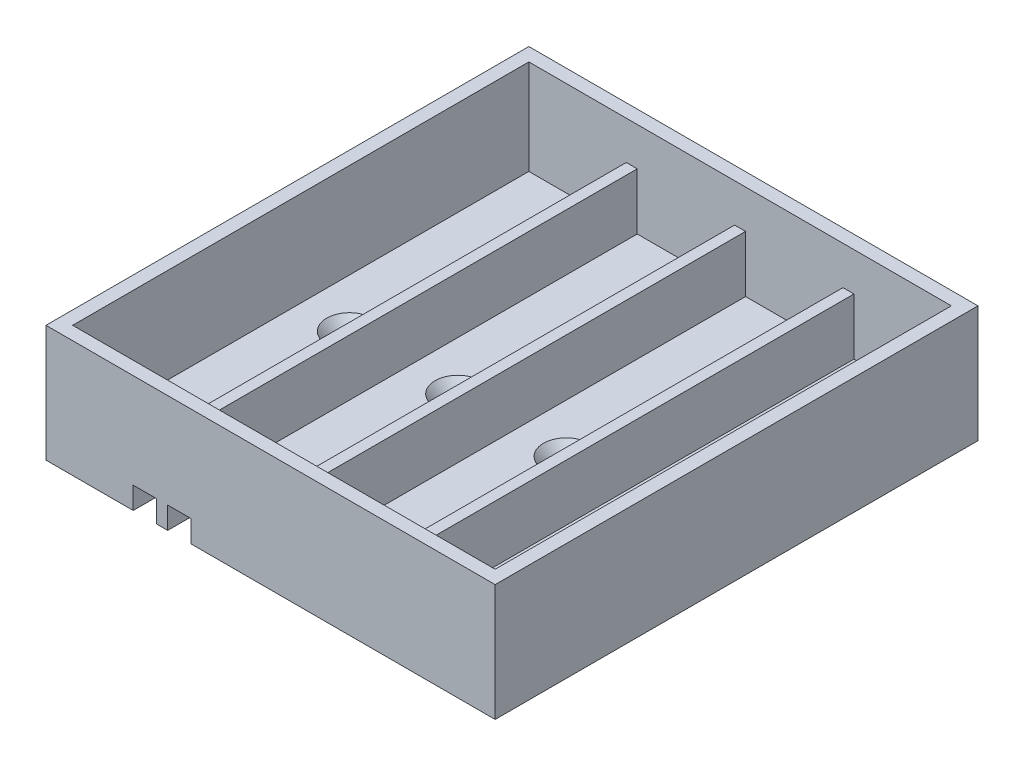
ISO-10303-21;
HEADER;
FILE_DESCRIPTION(('STEP AP214'),'2;1');
FILE_NAME('part.step','',(''),(''),'','','');
FILE_SCHEMA(('AUTOMOTIVE_DESIGN { 1 0 10303 214 1 1 1 1 }'));
ENDSEC;
DATA;
#1=APPLICATION_CONTEXT('core data for automotive mechanical design processes');
#2=APPLICATION_PROTOCOL_DEFINITION('international standard','automotive_design',2000,#1);
#3=PRODUCT_CONTEXT('',#1,'mechanical');
#4=PRODUCT('Part','Part','',(#3));
#5=PRODUCT_RELATED_PRODUCT_CATEGORY('part','',(#4));
#6=PRODUCT_DEFINITION_FORMATION('','',#4);
#7=PRODUCT_DEFINITION_CONTEXT('part definition',#1,'design');
#8=PRODUCT_DEFINITION('design','',#6,#7);
#9=PRODUCT_DEFINITION_SHAPE('','',#8);
#10=(LENGTH_UNIT() NAMED_UNIT(*) SI_UNIT(.MILLI.,.METRE.));
#11=(NAMED_UNIT(*) PLANE_ANGLE_UNIT() SI_UNIT($,.RADIAN.));
#12=(NAMED_UNIT(*) SI_UNIT($,.STERADIAN.) SOLID_ANGLE_UNIT());
#13=UNCERTAINTY_MEASURE_WITH_UNIT(LENGTH_MEASURE(1.E-05),#10,'distance_accuracy_value','');
#14=(GEOMETRIC_REPRESENTATION_CONTEXT(3) GLOBAL_UNCERTAINTY_ASSIGNED_CONTEXT((#13)) GLOBAL_UNIT_ASSIGNED_CONTEXT((#10,
#11,#12)) REPRESENTATION_CONTEXT('',''));
#15=CARTESIAN_POINT('',(0.,0.,0.));
#16=DIRECTION('',(0.,0.,1.));
#17=DIRECTION('',(1.,0.,0.));
#18=AXIS2_PLACEMENT_3D('',#15,#16,#17);
#19=CARTESIAN_POINT('',(-28.65,14.9,29.1));
#20=DIRECTION('',(0.,0.,-1.));
#21=DIRECTION('',(-1.,0.,0.));
#22=AXIS2_PLACEMENT_3D('',#19,#20,#21);
#23=PLANE('',#22);
#24=DIRECTION('',(-1.,0.,0.));
#25=VECTOR('',#24,1.);
#26=CARTESIAN_POINT('',(-28.65,10.,29.1));
#27=LINE('',#26,#25);
#28=CARTESIAN_POINT('',(14.525,10.,29.1));
#29=VERTEX_POINT('',#28);
#30=CARTESIAN_POINT('',(13.125,10.,29.1));
#31=VERTEX_POINT('',#30);
#32=EDGE_CURVE('E82',#29,#31,#27,.T.);
#33=ORIENTED_EDGE('',*,*,#32,.T.);
#34=DIRECTION('',(0.,-1.,0.));
#35=VECTOR('',#34,1.);
#36=CARTESIAN_POINT('',(13.125,14.9,29.1));
#37=LINE('',#36,#35);
#38=CARTESIAN_POINT('',(13.125,2.8,29.1));
#39=VERTEX_POINT('',#38);
#40=EDGE_CURVE('E291',#31,#39,#37,.T.);
#41=ORIENTED_EDGE('',*,*,#40,.T.);
#42=DIRECTION('',(-1.,0.,0.));
#43=VECTOR('',#42,1.);
#44=CARTESIAN_POINT('',(0.,2.8,29.1));
#45=LINE('',#44,#43);
#46=CARTESIAN_POINT('',(0.699999999999989,2.8,29.1));
#47=VERTEX_POINT('',#46);
#48=EDGE_CURVE('E450',#39,#47,#45,.T.);
#49=ORIENTED_EDGE('',*,*,#48,.T.);
#50=DIRECTION('',(0.,-1.,0.));
#51=VECTOR('',#50,1.);
#52=CARTESIAN_POINT('',(0.699999999999989,14.9,29.1));
#53=LINE('',#52,#51);
#54=CARTESIAN_POINT('',(0.699999999999989,10.,29.1));
#55=VERTEX_POINT('',#54);
#56=EDGE_CURVE('E307',#55,#47,#53,.T.);
#57=ORIENTED_EDGE('',*,*,#56,.F.);
#58=DIRECTION('',(-1.,0.,0.));
#59=VECTOR('',#58,1.);
#60=CARTESIAN_POINT('',(-28.65,10.,29.1));
#61=LINE('',#60,#59);
#62=CARTESIAN_POINT('',(-0.700000000000006,10.,29.1));
#63=VERTEX_POINT('',#62);
#64=EDGE_CURVE('E320',#55,#63,#61,.T.);
#65=ORIENTED_EDGE('',*,*,#64,.T.);
#66=DIRECTION('',(0.,-1.,0.));
#67=VECTOR('',#66,1.);
#68=CARTESIAN_POINT('',(-0.700000000000006,14.9,29.1));
#69=LINE('',#68,#67);
#70=CARTESIAN_POINT('',(-0.700000000000006,2.8,29.1));
#71=VERTEX_POINT('',#70);
#72=EDGE_CURVE('E315',#63,#71,#69,.T.);
#73=ORIENTED_EDGE('',*,*,#72,.T.);
#74=CARTESIAN_POINT('',(-10.125,2.8,29.1));
#75=VERTEX_POINT('',#74);
#76=EDGE_CURVE('E572',#71,#75,#45,.T.);
#77=ORIENTED_EDGE('',*,*,#76,.T.);
#78=CARTESIAN_POINT('',(-13.125,2.8,29.1));
#79=VERTEX_POINT('',#78);
#80=EDGE_CURVE('E379',#75,#79,#45,.T.);
#81=ORIENTED_EDGE('',*,*,#80,.T.);
#82=DIRECTION('',(0.,-1.,0.));
#83=VECTOR('',#82,1.);
#84=CARTESIAN_POINT('',(-13.125,14.9,29.1));
#85=LINE('',#84,#83);
#86=CARTESIAN_POINT('',(-13.125,10.,29.1));
#87=VERTEX_POINT('',#86);
#88=EDGE_CURVE('E341',#87,#79,#85,.T.);
#89=ORIENTED_EDGE('',*,*,#88,.F.);
#90=DIRECTION('',(-1.,0.,0.));
#91=VECTOR('',#90,1.);
#92=CARTESIAN_POINT('',(-28.65,10.,29.1));
#93=LINE('',#92,#91);
#94=CARTESIAN_POINT('',(-14.525,10.,29.1));
#95=VERTEX_POINT('',#94);
#96=EDGE_CURVE('E344',#87,#95,#93,.T.);
#97=ORIENTED_EDGE('',*,*,#96,.T.);
#98=DIRECTION('',(0.,-1.,0.));
#99=VECTOR('',#98,1.);
#100=CARTESIAN_POINT('',(-14.525,14.9,29.1));
#101=LINE('',#100,#99);
#102=CARTESIAN_POINT('',(-14.525,2.8,29.1));
#103=VERTEX_POINT('',#102);
#104=EDGE_CURVE('E333',#95,#103,#101,.T.);
#105=ORIENTED_EDGE('',*,*,#104,.T.);
#106=CARTESIAN_POINT('',(-17.525,2.8,29.1));
#107=VERTEX_POINT('',#106);
#108=EDGE_CURVE('E411',#103,#107,#45,.T.);
#109=ORIENTED_EDGE('',*,*,#108,.T.);
#110=CARTESIAN_POINT('',(-26.95,2.8,29.1));
#111=VERTEX_POINT('',#110);
#112=EDGE_CURVE('E446',#107,#111,#45,.T.);
#113=ORIENTED_EDGE('',*,*,#112,.T.);
#114=DIRECTION('',(0.,-1.,0.));
#115=VECTOR('',#114,1.);
#116=CARTESIAN_POINT('',(-26.95,14.9,29.1));
#117=LINE('',#116,#115);
#118=CARTESIAN_POINT('',(-26.95,14.9,29.1));
#119=VERTEX_POINT('',#118);
#120=EDGE_CURVE('E419',#119,#111,#117,.T.);
#121=ORIENTED_EDGE('',*,*,#120,.F.);
#122=DIRECTION('',(1.,0.,0.));
#123=VECTOR('',#122,1.);
#124=CARTESIAN_POINT('',(-28.65,14.9,29.1));
#125=LINE('',#124,#123);
#126=CARTESIAN_POINT('',(26.95,14.9,29.1));
#127=VERTEX_POINT('',#126);
#128=EDGE_CURVE('E408',#119,#127,#125,.T.);
#129=ORIENTED_EDGE('',*,*,#128,.T.);
#130=DIRECTION('',(0.,-1.,0.));
#131=VECTOR('',#130,1.);
#132=CARTESIAN_POINT('',(26.95,14.9,29.1));
#133=LINE('',#132,#131);
#134=CARTESIAN_POINT('',(26.95,2.8,29.1));
#135=VERTEX_POINT('',#134);
#136=EDGE_CURVE('E427',#127,#135,#133,.T.);
#137=ORIENTED_EDGE('',*,*,#136,.T.);
#138=CARTESIAN_POINT('',(14.525,2.8,29.1));
#139=VERTEX_POINT('',#138);
#140=EDGE_CURVE('E447',#135,#139,#45,.T.);
#141=ORIENTED_EDGE('',*,*,#140,.T.);
#142=DIRECTION('',(0.,-1.,0.));
#143=VECTOR('',#142,1.);
#144=CARTESIAN_POINT('',(14.525,14.9,29.1));
#145=LINE('',#144,#143);
#146=EDGE_CURVE('E87',#29,#139,#145,.T.);
#147=ORIENTED_EDGE('',*,*,#146,.F.);
#148=EDGE_LOOP('',(#33,#41,#49,#57,#65,#73,#77,#81,#89,#97,#105,#109,#113,#121,#129,#137,#141,#147));
#149=FACE_BOUND('',#148,.T.);
#150=ADVANCED_FACE('F66',(#149),#23,.T.);
#151=CARTESIAN_POINT('',(-28.65,14.9,-29.1));
#152=DIRECTION('',(0.,0.,-1.));
#153=DIRECTION('',(-1.,0.,0.));
#154=AXIS2_PLACEMENT_3D('',#151,#152,#153);
#155=PLANE('',#154);
#156=DIRECTION('',(0.,-1.,0.));
#157=VECTOR('',#156,1.);
#158=CARTESIAN_POINT('',(13.125,14.9,-29.1));
#159=LINE('',#158,#157);
#160=CARTESIAN_POINT('',(13.125,10.,-29.1));
#161=VERTEX_POINT('',#160);
#162=CARTESIAN_POINT('',(13.125,2.8,-29.1));
#163=VERTEX_POINT('',#162);
#164=EDGE_CURVE('E288',#161,#163,#159,.T.);
#165=ORIENTED_EDGE('',*,*,#164,.F.);
#166=DIRECTION('',(-1.,0.,0.));
#167=VECTOR('',#166,1.);
#168=CARTESIAN_POINT('',(-28.65,10.,-29.1));
#169=LINE('',#168,#167);
#170=CARTESIAN_POINT('',(14.525,10.,-29.1));
#171=VERTEX_POINT('',#170);
#172=EDGE_CURVE('E273',#171,#161,#169,.T.);
#173=ORIENTED_EDGE('',*,*,#172,.F.);
#174=DIRECTION('',(0.,-1.,0.));
#175=VECTOR('',#174,1.);
#176=CARTESIAN_POINT('',(14.525,14.9,-29.1));
#177=LINE('',#176,#175);
#178=CARTESIAN_POINT('',(14.525,2.8,-29.1));
#179=VERTEX_POINT('',#178);
#180=EDGE_CURVE('E270',#171,#179,#177,.T.);
#181=ORIENTED_EDGE('',*,*,#180,.T.);
#182=DIRECTION('',(-1.,0.,0.));
#183=VECTOR('',#182,1.);
#184=CARTESIAN_POINT('',(0.,2.8,-29.1));
#185=LINE('',#184,#183);
#186=CARTESIAN_POINT('',(26.95,2.8,-29.1));
#187=VERTEX_POINT('',#186);
#188=EDGE_CURVE('E256',#187,#179,#185,.T.);
#189=ORIENTED_EDGE('',*,*,#188,.F.);
#190=DIRECTION('',(0.,-1.,0.));
#191=VECTOR('',#190,1.);
#192=CARTESIAN_POINT('',(26.95,14.9,-29.1));
#193=LINE('',#192,#191);
#194=CARTESIAN_POINT('',(26.95,14.9,-29.1));
#195=VERTEX_POINT('',#194);
#196=EDGE_CURVE('E425',#195,#187,#193,.T.);
#197=ORIENTED_EDGE('',*,*,#196,.F.);
#198=DIRECTION('',(1.,0.,0.));
#199=VECTOR('',#198,1.);
#200=CARTESIAN_POINT('',(-28.65,14.9,-29.1));
#201=LINE('',#200,#199);
#202=CARTESIAN_POINT('',(-26.95,14.9,-29.1));
#203=VERTEX_POINT('',#202);
#204=EDGE_CURVE('E413',#203,#195,#201,.T.);
#205=ORIENTED_EDGE('',*,*,#204,.F.);
#206=DIRECTION('',(0.,-1.,0.));
#207=VECTOR('',#206,1.);
#208=CARTESIAN_POINT('',(-26.95,14.9,-29.1));
#209=LINE('',#208,#207);
#210=CARTESIAN_POINT('',(-26.95,2.8,-29.1));
#211=VERTEX_POINT('',#210);
#212=EDGE_CURVE('E422',#203,#211,#209,.T.);
#213=ORIENTED_EDGE('',*,*,#212,.T.);
#214=CARTESIAN_POINT('',(-14.525,2.8,-29.1));
#215=VERTEX_POINT('',#214);
#216=EDGE_CURVE('E268',#215,#211,#185,.T.);
#217=ORIENTED_EDGE('',*,*,#216,.F.);
#218=DIRECTION('',(0.,-1.,0.));
#219=VECTOR('',#218,1.);
#220=CARTESIAN_POINT('',(-14.525,14.9,-29.1));
#221=LINE('',#220,#219);
#222=CARTESIAN_POINT('',(-14.525,10.,-29.1));
#223=VERTEX_POINT('',#222);
#224=EDGE_CURVE('E330',#223,#215,#221,.T.);
#225=ORIENTED_EDGE('',*,*,#224,.F.);
#226=DIRECTION('',(-1.,0.,0.));
#227=VECTOR('',#226,1.);
#228=CARTESIAN_POINT('',(-28.65,10.,-29.1));
#229=LINE('',#228,#227);
#230=CARTESIAN_POINT('',(-13.125,10.,-29.1));
#231=VERTEX_POINT('',#230);
#232=EDGE_CURVE('E473',#231,#223,#229,.T.);
#233=ORIENTED_EDGE('',*,*,#232,.F.);
#234=DIRECTION('',(0.,-1.,0.));
#235=VECTOR('',#234,1.);
#236=CARTESIAN_POINT('',(-13.125,14.9,-29.1));
#237=LINE('',#236,#235);
#238=CARTESIAN_POINT('',(-13.125,2.8,-29.1));
#239=VERTEX_POINT('',#238);
#240=EDGE_CURVE('E338',#231,#239,#237,.T.);
#241=ORIENTED_EDGE('',*,*,#240,.T.);
#242=CARTESIAN_POINT('',(-0.700000000000006,2.8,-29.1));
#243=VERTEX_POINT('',#242);
#244=EDGE_CURVE('E583',#243,#239,#185,.T.);
#245=ORIENTED_EDGE('',*,*,#244,.F.);
#246=DIRECTION('',(0.,-1.,0.));
#247=VECTOR('',#246,1.);
#248=CARTESIAN_POINT('',(-0.700000000000006,14.9,-29.1));
#249=LINE('',#248,#247);
#250=CARTESIAN_POINT('',(-0.700000000000006,10.,-29.1));
#251=VERTEX_POINT('',#250);
#252=EDGE_CURVE('E312',#251,#243,#249,.T.);
#253=ORIENTED_EDGE('',*,*,#252,.F.);
#254=DIRECTION('',(-1.,0.,0.));
#255=VECTOR('',#254,1.);
#256=CARTESIAN_POINT('',(-28.65,10.,-29.1));
#257=LINE('',#256,#255);
#258=CARTESIAN_POINT('',(0.699999999999989,10.,-29.1));
#259=VERTEX_POINT('',#258);
#260=EDGE_CURVE('E317',#259,#251,#257,.T.);
#261=ORIENTED_EDGE('',*,*,#260,.F.);
#262=DIRECTION('',(0.,-1.,0.));
#263=VECTOR('',#262,1.);
#264=CARTESIAN_POINT('',(0.699999999999989,14.9,-29.1));
#265=LINE('',#264,#263);
#266=CARTESIAN_POINT('',(0.699999999999989,2.8,-29.1));
#267=VERTEX_POINT('',#266);
#268=EDGE_CURVE('E304',#259,#267,#265,.T.);
#269=ORIENTED_EDGE('',*,*,#268,.T.);
#270=EDGE_CURVE('E266',#163,#267,#185,.T.);
#271=ORIENTED_EDGE('',*,*,#270,.F.);
#272=EDGE_LOOP('',(#165,#173,#181,#189,#197,#205,#213,#217,#225,#233,#241,#245,#253,#261,#269,#271));
#273=FACE_BOUND('',#272,.T.);
#274=ADVANCED_FACE('F271',(#273),#155,.F.);
#275=CARTESIAN_POINT('',(0.,2.8,0.));
#276=DIRECTION('',(0.,1.,0.));
#277=DIRECTION('',(0.,0.,1.));
#278=AXIS2_PLACEMENT_3D('',#275,#276,#277);
#279=PLANE('',#278);
#280=CARTESIAN_POINT('',(6.91249999999999,2.8,0.));
#281=DIRECTION('',(0.,1.,0.));
#282=DIRECTION('',(0.,0.,1.));
#283=AXIS2_PLACEMENT_3D('',#280,#281,#282);
#284=CIRCLE('',#283,2.9);
#285=CARTESIAN_POINT('',(6.91249999999999,2.8,2.89999999999999));
#286=VERTEX_POINT('',#285);
#287=EDGE_CURVE('E488',#286,#286,#284,.F.);
#288=ORIENTED_EDGE('',*,*,#287,.T.);
#289=EDGE_LOOP('',(#288));
#290=FACE_BOUND('',#289,.T.);
#291=ORIENTED_EDGE('',*,*,#48,.F.);
#292=DIRECTION('',(0.,0.,-1.));
#293=VECTOR('',#292,1.);
#294=CARTESIAN_POINT('',(13.125,2.8,0.));
#295=LINE('',#294,#293);
#296=EDGE_CURVE('E286',#39,#163,#295,.T.);
#297=ORIENTED_EDGE('',*,*,#296,.T.);
#298=ORIENTED_EDGE('',*,*,#270,.T.);
#299=DIRECTION('',(0.,0.,-1.));
#300=VECTOR('',#299,1.);
#301=CARTESIAN_POINT('',(0.699999999999989,2.8,0.));
#302=LINE('',#301,#300);
#303=EDGE_CURVE('E301',#47,#267,#302,.T.);
#304=ORIENTED_EDGE('',*,*,#303,.F.);
#305=EDGE_LOOP('',(#291,#297,#298,#304));
#306=FACE_BOUND('',#305,.T.);
#307=ADVANCED_FACE('F511',(#290,#306),#279,.T.);
#308=CARTESIAN_POINT('',(-6.91250000000001,2.8,0.));
#309=DIRECTION('',(0.,1.,0.));
#310=DIRECTION('',(0.,0.,1.));
#311=AXIS2_PLACEMENT_3D('',#308,#309,#310);
#312=CIRCLE('',#311,2.89999999999999);
#313=CARTESIAN_POINT('',(-6.91250000000001,2.8,2.89999999999999));
#314=VERTEX_POINT('',#313);
#315=EDGE_CURVE('E482',#314,#314,#312,.F.);
#316=ORIENTED_EDGE('',*,*,#315,.T.);
#317=EDGE_LOOP('',(#316));
#318=FACE_BOUND('',#317,.T.);
#319=ORIENTED_EDGE('',*,*,#76,.F.);
#320=DIRECTION('',(0.,0.,-1.));
#321=VECTOR('',#320,1.);
#322=CARTESIAN_POINT('',(-0.700000000000006,2.8,0.));
#323=LINE('',#322,#321);
#324=EDGE_CURVE('E310',#71,#243,#323,.T.);
#325=ORIENTED_EDGE('',*,*,#324,.T.);
#326=ORIENTED_EDGE('',*,*,#244,.T.);
#327=DIRECTION('',(0.,0.,-1.));
#328=VECTOR('',#327,1.);
#329=CARTESIAN_POINT('',(-13.125,2.8,0.));
#330=LINE('',#329,#328);
#331=CARTESIAN_POINT('',(-13.125,2.8,24.));
#332=VERTEX_POINT('',#331);
#333=EDGE_CURVE('E335',#332,#239,#330,.T.);
#334=ORIENTED_EDGE('',*,*,#333,.F.);
#335=DIRECTION('',(1.,0.,0.));
#336=VECTOR('',#335,1.);
#337=CARTESIAN_POINT('',(-13.125,2.8,24.));
#338=LINE('',#337,#336);
#339=CARTESIAN_POINT('',(-10.125,2.8,24.));
#340=VERTEX_POINT('',#339);
#341=EDGE_CURVE('E385',#332,#340,#338,.T.);
#342=ORIENTED_EDGE('',*,*,#341,.T.);
#343=DIRECTION('',(0.,0.,-1.));
#344=VECTOR('',#343,1.);
#345=CARTESIAN_POINT('',(-10.125,2.8,30.8));
#346=LINE('',#345,#344);
#347=EDGE_CURVE('E397',#75,#340,#346,.T.);
#348=ORIENTED_EDGE('',*,*,#347,.F.);
#349=EDGE_LOOP('',(#319,#325,#326,#334,#342,#348));
#350=FACE_BOUND('',#349,.T.);
#351=ADVANCED_FACE('F567',(#318,#350),#279,.T.);
#352=CARTESIAN_POINT('',(-20.7375,2.8,0.));
#353=DIRECTION('',(0.,1.,0.));
#354=DIRECTION('',(0.,0.,1.));
#355=AXIS2_PLACEMENT_3D('',#352,#353,#354);
#356=CIRCLE('',#355,2.9);
#357=CARTESIAN_POINT('',(-20.7375,2.8,2.9));
#358=VERTEX_POINT('',#357);
#359=EDGE_CURVE('E476',#358,#358,#356,.F.);
#360=ORIENTED_EDGE('',*,*,#359,.T.);
#361=EDGE_LOOP('',(#360));
#362=FACE_BOUND('',#361,.T.);
#363=DIRECTION('',(1.,0.,0.));
#364=VECTOR('',#363,1.);
#365=CARTESIAN_POINT('',(-17.525,2.8,24.));
#366=LINE('',#365,#364);
#367=CARTESIAN_POINT('',(-17.525,2.8,24.));
#368=VERTEX_POINT('',#367);
#369=CARTESIAN_POINT('',(-14.525,2.8,24.));
#370=VERTEX_POINT('',#369);
#371=EDGE_CURVE('E369',#368,#370,#366,.T.);
#372=ORIENTED_EDGE('',*,*,#371,.T.);
#373=DIRECTION('',(0.,0.,-1.));
#374=VECTOR('',#373,1.);
#375=CARTESIAN_POINT('',(-14.525,2.8,0.));
#376=LINE('',#375,#374);
#377=EDGE_CURVE('E328',#370,#215,#376,.T.);
#378=ORIENTED_EDGE('',*,*,#377,.T.);
#379=ORIENTED_EDGE('',*,*,#216,.T.);
#380=DIRECTION('',(0.,0.,1.));
#381=VECTOR('',#380,1.);
#382=CARTESIAN_POINT('',(-26.95,2.8,0.));
#383=LINE('',#382,#381);
#384=EDGE_CURVE('E442',#211,#111,#383,.T.);
#385=ORIENTED_EDGE('',*,*,#384,.T.);
#386=ORIENTED_EDGE('',*,*,#112,.F.);
#387=DIRECTION('',(0.,0.,-1.));
#388=VECTOR('',#387,1.);
#389=CARTESIAN_POINT('',(-17.525,2.8,30.8));
#390=LINE('',#389,#388);
#391=EDGE_CURVE('E353',#107,#368,#390,.T.);
#392=ORIENTED_EDGE('',*,*,#391,.T.);
#393=EDGE_LOOP('',(#372,#378,#379,#385,#386,#392));
#394=FACE_BOUND('',#393,.T.);
#395=ADVANCED_FACE('F524',(#362,#394),#279,.T.);
#396=CARTESIAN_POINT('',(20.7375,2.8,0.));
#397=DIRECTION('',(0.,1.,0.));
#398=DIRECTION('',(0.,0.,1.));
#399=AXIS2_PLACEMENT_3D('',#396,#397,#398);
#400=CIRCLE('',#399,2.9);
#401=CARTESIAN_POINT('',(20.7375,2.8,2.9));
#402=VERTEX_POINT('',#401);
#403=EDGE_CURVE('E75',#402,#402,#400,.F.);
#404=ORIENTED_EDGE('',*,*,#403,.T.);
#405=EDGE_LOOP('',(#404));
#406=FACE_BOUND('',#405,.T.);
#407=DIRECTION('',(0.,0.,-1.));
#408=VECTOR('',#407,1.);
#409=CARTESIAN_POINT('',(14.525,2.8,0.));
#410=LINE('',#409,#408);
#411=EDGE_CURVE('E261',#139,#179,#410,.T.);
#412=ORIENTED_EDGE('',*,*,#411,.F.);
#413=ORIENTED_EDGE('',*,*,#140,.F.);
#414=DIRECTION('',(0.,0.,1.));
#415=VECTOR('',#414,1.);
#416=CARTESIAN_POINT('',(26.95,2.8,0.));
#417=LINE('',#416,#415);
#418=EDGE_CURVE('E262',#187,#135,#417,.T.);
#419=ORIENTED_EDGE('',*,*,#418,.F.);
#420=ORIENTED_EDGE('',*,*,#188,.T.);
#421=EDGE_LOOP('',(#412,#413,#419,#420));
#422=FACE_BOUND('',#421,.T.);
#423=ADVANCED_FACE('F258',(#406,#422),#279,.T.);
#424=CARTESIAN_POINT('',(-28.65,2.8,30.8));
#425=DIRECTION('',(0.,0.,-1.));
#426=DIRECTION('',(-1.,0.,0.));
#427=AXIS2_PLACEMENT_3D('',#424,#425,#426);
#428=PLANE('',#427);
#429=DIRECTION('',(1.,0.,0.));
#430=VECTOR('',#429,1.);
#431=CARTESIAN_POINT('',(-28.65,0.,30.8));
#432=LINE('',#431,#430);
#433=CARTESIAN_POINT('',(-10.125,0.,30.8));
#434=VERTEX_POINT('',#433);
#435=CARTESIAN_POINT('',(28.65,0.,30.8));
#436=VERTEX_POINT('',#435);
#437=EDGE_CURVE('E449',#434,#436,#432,.T.);
#438=ORIENTED_EDGE('',*,*,#437,.T.);
#439=DIRECTION('',(0.,-1.,0.));
#440=VECTOR('',#439,1.);
#441=CARTESIAN_POINT('',(28.65,2.8,30.8));
#442=LINE('',#441,#440);
#443=CARTESIAN_POINT('',(28.65,14.9,30.8));
#444=VERTEX_POINT('',#443);
#445=EDGE_CURVE('E470',#444,#436,#442,.T.);
#446=ORIENTED_EDGE('',*,*,#445,.F.);
#447=DIRECTION('',(1.,0.,0.));
#448=VECTOR('',#447,1.);
#449=CARTESIAN_POINT('',(-28.65,14.9,30.8));
#450=LINE('',#449,#448);
#451=CARTESIAN_POINT('',(-28.65,14.9,30.8));
#452=VERTEX_POINT('',#451);
#453=EDGE_CURVE('E430',#452,#444,#450,.T.);
#454=ORIENTED_EDGE('',*,*,#453,.F.);
#455=DIRECTION('',(0.,-1.,0.));
#456=VECTOR('',#455,1.);
#457=CARTESIAN_POINT('',(-28.65,2.8,30.8));
#458=LINE('',#457,#456);
#459=CARTESIAN_POINT('',(-28.65,0.,30.8));
#460=VERTEX_POINT('',#459);
#461=EDGE_CURVE('E463',#452,#460,#458,.T.);
#462=ORIENTED_EDGE('',*,*,#461,.T.);
#463=CARTESIAN_POINT('',(-17.525,0.,30.8));
#464=VERTEX_POINT('',#463);
#465=EDGE_CURVE('E451',#460,#464,#432,.T.);
#466=ORIENTED_EDGE('',*,*,#465,.T.);
#467=DIRECTION('',(0.,-1.,0.));
#468=VECTOR('',#467,1.);
#469=CARTESIAN_POINT('',(-17.525,10.2323616704248,30.8));
#470=LINE('',#469,#468);
#471=CARTESIAN_POINT('',(-17.525,2.8,30.8));
#472=VERTEX_POINT('',#471);
#473=EDGE_CURVE('E357',#472,#464,#470,.T.);
#474=ORIENTED_EDGE('',*,*,#473,.F.);
#475=DIRECTION('',(1.,0.,0.));
#476=VECTOR('',#475,1.);
#477=CARTESIAN_POINT('',(-17.525,2.8,30.8));
#478=LINE('',#477,#476);
#479=CARTESIAN_POINT('',(-14.525,2.8,30.8));
#480=VERTEX_POINT('',#479);
#481=EDGE_CURVE('E363',#472,#480,#478,.T.);
#482=ORIENTED_EDGE('',*,*,#481,.T.);
#483=DIRECTION('',(0.,-1.,0.));
#484=VECTOR('',#483,1.);
#485=CARTESIAN_POINT('',(-14.525,10.2323616704248,30.8));
#486=LINE('',#485,#484);
#487=CARTESIAN_POINT('',(-14.525,0.,30.8));
#488=VERTEX_POINT('',#487);
#489=EDGE_CURVE('E358',#480,#488,#486,.T.);
#490=ORIENTED_EDGE('',*,*,#489,.T.);
#491=CARTESIAN_POINT('',(-13.125,0.,30.8));
#492=VERTEX_POINT('',#491);
#493=EDGE_CURVE('E455',#488,#492,#432,.T.);
#494=ORIENTED_EDGE('',*,*,#493,.T.);
#495=DIRECTION('',(0.,-1.,0.));
#496=VECTOR('',#495,1.);
#497=CARTESIAN_POINT('',(-13.125,10.2323616704248,30.8));
#498=LINE('',#497,#496);
#499=CARTESIAN_POINT('',(-13.125,2.8,30.8));
#500=VERTEX_POINT('',#499);
#501=EDGE_CURVE('E346',#500,#492,#498,.T.);
#502=ORIENTED_EDGE('',*,*,#501,.F.);
#503=DIRECTION('',(1.,0.,0.));
#504=VECTOR('',#503,1.);
#505=CARTESIAN_POINT('',(-13.125,2.8,30.8));
#506=LINE('',#505,#504);
#507=CARTESIAN_POINT('',(-10.125,2.8,30.8));
#508=VERTEX_POINT('',#507);
#509=EDGE_CURVE('E366',#500,#508,#506,.T.);
#510=ORIENTED_EDGE('',*,*,#509,.T.);
#511=DIRECTION('',(0.,-1.,0.));
#512=VECTOR('',#511,1.);
#513=CARTESIAN_POINT('',(-10.125,10.2323616704248,30.8));
#514=LINE('',#513,#512);
#515=EDGE_CURVE('E389',#508,#434,#514,.T.);
#516=ORIENTED_EDGE('',*,*,#515,.T.);
#517=EDGE_LOOP('',(#438,#446,#454,#462,#466,#474,#482,#490,#494,#502,#510,#516));
#518=FACE_BOUND('',#517,.T.);
#519=ADVANCED_FACE('F523',(#518),#428,.F.);
#520=CARTESIAN_POINT('',(28.65,2.8,30.8));
#521=DIRECTION('',(-1.,0.,0.));
#522=DIRECTION('',(0.,0.,1.));
#523=AXIS2_PLACEMENT_3D('',#520,#521,#522);
#524=PLANE('',#523);
#525=DIRECTION('',(0.,0.,-1.));
#526=VECTOR('',#525,1.);
#527=CARTESIAN_POINT('',(28.65,0.,30.8));
#528=LINE('',#527,#526);
#529=CARTESIAN_POINT('',(28.65,0.,-30.8));
#530=VERTEX_POINT('',#529);
#531=EDGE_CURVE('E454',#436,#530,#528,.T.);
#532=ORIENTED_EDGE('',*,*,#531,.T.);
#533=DIRECTION('',(0.,-1.,0.));
#534=VECTOR('',#533,1.);
#535=CARTESIAN_POINT('',(28.65,2.8,-30.8));
#536=LINE('',#535,#534);
#537=CARTESIAN_POINT('',(28.65,14.9,-30.8));
#538=VERTEX_POINT('',#537);
#539=EDGE_CURVE('E467',#538,#530,#536,.T.);
#540=ORIENTED_EDGE('',*,*,#539,.F.);
#541=DIRECTION('',(0.,0.,-1.));
#542=VECTOR('',#541,1.);
#543=CARTESIAN_POINT('',(28.65,14.9,30.8));
#544=LINE('',#543,#542);
#545=EDGE_CURVE('E433',#444,#538,#544,.T.);
#546=ORIENTED_EDGE('',*,*,#545,.F.);
#547=ORIENTED_EDGE('',*,*,#445,.T.);
#548=EDGE_LOOP('',(#532,#540,#546,#547));
#549=FACE_BOUND('',#548,.T.);
#550=ADVANCED_FACE('F535',(#549),#524,.F.);
#551=CARTESIAN_POINT('',(-28.65,2.8,-30.8));
#552=DIRECTION('',(0.,0.,-1.));
#553=DIRECTION('',(-1.,0.,0.));
#554=AXIS2_PLACEMENT_3D('',#551,#552,#553);
#555=PLANE('',#554);
#556=ORIENTED_EDGE('',*,*,#539,.T.);
#557=DIRECTION('',(1.,0.,0.));
#558=VECTOR('',#557,1.);
#559=CARTESIAN_POINT('',(-28.65,0.,-30.8));
#560=LINE('',#559,#558);
#561=CARTESIAN_POINT('',(-28.65,0.,-30.8));
#562=VERTEX_POINT('',#561);
#563=EDGE_CURVE('E458',#562,#530,#560,.T.);
#564=ORIENTED_EDGE('',*,*,#563,.F.);
#565=DIRECTION('',(0.,-1.,0.));
#566=VECTOR('',#565,1.);
#567=CARTESIAN_POINT('',(-28.65,2.8,-30.8));
#568=LINE('',#567,#566);
#569=CARTESIAN_POINT('',(-28.65,14.9,-30.8));
#570=VERTEX_POINT('',#569);
#571=EDGE_CURVE('E465',#570,#562,#568,.T.);
#572=ORIENTED_EDGE('',*,*,#571,.F.);
#573=DIRECTION('',(1.,0.,0.));
#574=VECTOR('',#573,1.);
#575=CARTESIAN_POINT('',(-28.65,14.9,-30.8));
#576=LINE('',#575,#574);
#577=EDGE_CURVE('E436',#570,#538,#576,.T.);
#578=ORIENTED_EDGE('',*,*,#577,.T.);
#579=EDGE_LOOP('',(#556,#564,#572,#578));
#580=FACE_BOUND('',#579,.T.);
#581=ADVANCED_FACE('F531',(#580),#555,.T.);
#582=CARTESIAN_POINT('',(-28.65,2.8,30.8));
#583=DIRECTION('',(-1.,0.,0.));
#584=DIRECTION('',(0.,0.,1.));
#585=AXIS2_PLACEMENT_3D('',#582,#583,#584);
#586=PLANE('',#585);
#587=DIRECTION('',(0.,0.,-1.));
#588=VECTOR('',#587,1.);
#589=CARTESIAN_POINT('',(-28.65,0.,30.8));
#590=LINE('',#589,#588);
#591=EDGE_CURVE('E460',#460,#562,#590,.T.);
#592=ORIENTED_EDGE('',*,*,#591,.F.);
#593=ORIENTED_EDGE('',*,*,#461,.F.);
#594=DIRECTION('',(0.,0.,-1.));
#595=VECTOR('',#594,1.);
#596=CARTESIAN_POINT('',(-28.65,14.9,30.8));
#597=LINE('',#596,#595);
#598=EDGE_CURVE('E439',#452,#570,#597,.T.);
#599=ORIENTED_EDGE('',*,*,#598,.T.);
#600=ORIENTED_EDGE('',*,*,#571,.T.);
#601=EDGE_LOOP('',(#592,#593,#599,#600));
#602=FACE_BOUND('',#601,.T.);
#603=ADVANCED_FACE('F527',(#602),#586,.T.);
#604=CARTESIAN_POINT('',(0.,0.,0.));
#605=DIRECTION('',(0.,1.,0.));
#606=DIRECTION('',(0.,0.,1.));
#607=AXIS2_PLACEMENT_3D('',#604,#605,#606);
#608=PLANE('',#607);
#609=CARTESIAN_POINT('',(-20.7375,0.,0.));
#610=DIRECTION('',(0.,1.,0.));
#611=DIRECTION('',(0.,0.,1.));
#612=AXIS2_PLACEMENT_3D('',#609,#610,#611);
#613=CIRCLE('',#612,1.9);
#614=CARTESIAN_POINT('',(-20.7375,0.,1.9));
#615=VERTEX_POINT('',#614);
#616=EDGE_CURVE('E599',#615,#615,#613,.T.);
#617=ORIENTED_EDGE('',*,*,#616,.T.);
#618=EDGE_LOOP('',(#617));
#619=FACE_BOUND('',#618,.T.);
#620=CARTESIAN_POINT('',(-6.91250000000001,0.,0.));
#621=DIRECTION('',(0.,1.,0.));
#622=DIRECTION('',(0.,0.,1.));
#623=AXIS2_PLACEMENT_3D('',#620,#621,#622);
#624=CIRCLE('',#623,1.9);
#625=CARTESIAN_POINT('',(-6.91250000000001,0.,1.89999999999999));
#626=VERTEX_POINT('',#625);
#627=EDGE_CURVE('E601',#626,#626,#624,.T.);
#628=ORIENTED_EDGE('',*,*,#627,.T.);
#629=EDGE_LOOP('',(#628));
#630=FACE_BOUND('',#629,.T.);
#631=CARTESIAN_POINT('',(6.91249999999999,0.,0.));
#632=DIRECTION('',(0.,1.,0.));
#633=DIRECTION('',(0.,0.,1.));
#634=AXIS2_PLACEMENT_3D('',#631,#632,#633);
#635=CIRCLE('',#634,1.9);
#636=CARTESIAN_POINT('',(6.91249999999999,0.,1.89999999999999));
#637=VERTEX_POINT('',#636);
#638=EDGE_CURVE('E607',#637,#637,#635,.T.);
#639=ORIENTED_EDGE('',*,*,#638,.T.);
#640=EDGE_LOOP('',(#639));
#641=FACE_BOUND('',#640,.T.);
#642=CARTESIAN_POINT('',(20.7375,0.,0.));
#643=DIRECTION('',(0.,1.,0.));
#644=DIRECTION('',(0.,0.,1.));
#645=AXIS2_PLACEMENT_3D('',#642,#643,#644);
#646=CIRCLE('',#645,1.9);
#647=CARTESIAN_POINT('',(20.7375,0.,1.9));
#648=VERTEX_POINT('',#647);
#649=EDGE_CURVE('E604',#648,#648,#646,.T.);
#650=ORIENTED_EDGE('',*,*,#649,.T.);
#651=EDGE_LOOP('',(#650));
#652=FACE_BOUND('',#651,.T.);
#653=ORIENTED_EDGE('',*,*,#531,.F.);
#654=ORIENTED_EDGE('',*,*,#437,.F.);
#655=DIRECTION('',(0.,0.,-1.));
#656=VECTOR('',#655,1.);
#657=CARTESIAN_POINT('',(-10.125,0.,30.8));
#658=LINE('',#657,#656);
#659=CARTESIAN_POINT('',(-10.125,0.,24.));
#660=VERTEX_POINT('',#659);
#661=EDGE_CURVE('E381',#434,#660,#658,.T.);
#662=ORIENTED_EDGE('',*,*,#661,.T.);
#663=DIRECTION('',(1.,0.,0.));
#664=VECTOR('',#663,1.);
#665=CARTESIAN_POINT('',(-13.125,0.,24.));
#666=LINE('',#665,#664);
#667=CARTESIAN_POINT('',(-13.125,0.,24.));
#668=VERTEX_POINT('',#667);
#669=EDGE_CURVE('E401',#668,#660,#666,.T.);
#670=ORIENTED_EDGE('',*,*,#669,.F.);
#671=DIRECTION('',(0.,0.,-1.));
#672=VECTOR('',#671,1.);
#673=CARTESIAN_POINT('',(-13.125,0.,30.8));
#674=LINE('',#673,#672);
#675=EDGE_CURVE('E405',#492,#668,#674,.T.);
#676=ORIENTED_EDGE('',*,*,#675,.F.);
#677=ORIENTED_EDGE('',*,*,#493,.F.);
#678=DIRECTION('',(0.,0.,-1.));
#679=VECTOR('',#678,1.);
#680=CARTESIAN_POINT('',(-14.525,0.,30.8));
#681=LINE('',#680,#679);
#682=CARTESIAN_POINT('',(-14.525,0.,24.));
#683=VERTEX_POINT('',#682);
#684=EDGE_CURVE('E354',#488,#683,#681,.T.);
#685=ORIENTED_EDGE('',*,*,#684,.T.);
#686=DIRECTION('',(1.,0.,0.));
#687=VECTOR('',#686,1.);
#688=CARTESIAN_POINT('',(-17.525,0.,24.));
#689=LINE('',#688,#687);
#690=CARTESIAN_POINT('',(-17.525,0.,24.));
#691=VERTEX_POINT('',#690);
#692=EDGE_CURVE('E350',#691,#683,#689,.T.);
#693=ORIENTED_EDGE('',*,*,#692,.F.);
#694=DIRECTION('',(0.,0.,-1.));
#695=VECTOR('',#694,1.);
#696=CARTESIAN_POINT('',(-17.525,0.,30.8));
#697=LINE('',#696,#695);
#698=EDGE_CURVE('E347',#464,#691,#697,.T.);
#699=ORIENTED_EDGE('',*,*,#698,.F.);
#700=ORIENTED_EDGE('',*,*,#465,.F.);
#701=ORIENTED_EDGE('',*,*,#591,.T.);
#702=ORIENTED_EDGE('',*,*,#563,.T.);
#703=EDGE_LOOP('',(#653,#654,#662,#670,#676,#677,#685,#693,#699,#700,#701,#702));
#704=FACE_BOUND('',#703,.T.);
#705=ADVANCED_FACE('F519',(#619,#630,#641,#652,#704),#608,.F.);
#706=CARTESIAN_POINT('',(0.,14.9,0.));
#707=DIRECTION('',(0.,1.,0.));
#708=DIRECTION('',(0.,0.,1.));
#709=AXIS2_PLACEMENT_3D('',#706,#707,#708);
#710=PLANE('',#709);
#711=ORIENTED_EDGE('',*,*,#453,.T.);
#712=ORIENTED_EDGE('',*,*,#545,.T.);
#713=ORIENTED_EDGE('',*,*,#577,.F.);
#714=ORIENTED_EDGE('',*,*,#598,.F.);
#715=EDGE_LOOP('',(#711,#712,#713,#714));
#716=FACE_BOUND('',#715,.T.);
#717=DIRECTION('',(0.,0.,-1.));
#718=VECTOR('',#717,1.);
#719=CARTESIAN_POINT('',(26.95,14.9,30.8));
#720=LINE('',#719,#718);
#721=EDGE_CURVE('E410',#127,#195,#720,.T.);
#722=ORIENTED_EDGE('',*,*,#721,.F.);
#723=ORIENTED_EDGE('',*,*,#128,.F.);
#724=DIRECTION('',(0.,0.,-1.));
#725=VECTOR('',#724,1.);
#726=CARTESIAN_POINT('',(-26.95,14.9,30.8));
#727=LINE('',#726,#725);
#728=EDGE_CURVE('E416',#119,#203,#727,.T.);
#729=ORIENTED_EDGE('',*,*,#728,.T.);
#730=ORIENTED_EDGE('',*,*,#204,.T.);
#731=EDGE_LOOP('',(#722,#723,#729,#730));
#732=FACE_BOUND('',#731,.T.);
#733=ADVANCED_FACE('F516',(#716,#732),#710,.T.);
#734=CARTESIAN_POINT('',(26.95,14.9,30.8));
#735=DIRECTION('',(-1.,0.,0.));
#736=DIRECTION('',(0.,0.,1.));
#737=AXIS2_PLACEMENT_3D('',#734,#735,#736);
#738=PLANE('',#737);
#739=ORIENTED_EDGE('',*,*,#196,.T.);
#740=ORIENTED_EDGE('',*,*,#418,.T.);
#741=ORIENTED_EDGE('',*,*,#136,.F.);
#742=ORIENTED_EDGE('',*,*,#721,.T.);
#743=EDGE_LOOP('',(#739,#740,#741,#742));
#744=FACE_BOUND('',#743,.T.);
#745=ADVANCED_FACE('F515',(#744),#738,.T.);
#746=CARTESIAN_POINT('',(-26.95,14.9,30.8));
#747=DIRECTION('',(-1.,0.,0.));
#748=DIRECTION('',(0.,0.,1.));
#749=AXIS2_PLACEMENT_3D('',#746,#747,#748);
#750=PLANE('',#749);
#751=ORIENTED_EDGE('',*,*,#384,.F.);
#752=ORIENTED_EDGE('',*,*,#212,.F.);
#753=ORIENTED_EDGE('',*,*,#728,.F.);
#754=ORIENTED_EDGE('',*,*,#120,.T.);
#755=EDGE_LOOP('',(#751,#752,#753,#754));
#756=FACE_BOUND('',#755,.T.);
#757=ADVANCED_FACE('F671',(#756),#750,.F.);
#758=CARTESIAN_POINT('',(0.,2.8,0.));
#759=DIRECTION('',(0.,1.,0.));
#760=DIRECTION('',(0.,0.,1.));
#761=AXIS2_PLACEMENT_3D('',#758,#759,#760);
#762=PLANE('',#761);
#763=EDGE_CURVE('E394',#508,#75,#346,.T.);
#764=ORIENTED_EDGE('',*,*,#763,.F.);
#765=ORIENTED_EDGE('',*,*,#509,.F.);
#766=DIRECTION('',(0.,0.,-1.));
#767=VECTOR('',#766,1.);
#768=CARTESIAN_POINT('',(-13.125,2.8,30.8));
#769=LINE('',#768,#767);
#770=EDGE_CURVE('E384',#500,#79,#769,.T.);
#771=ORIENTED_EDGE('',*,*,#770,.T.);
#772=ORIENTED_EDGE('',*,*,#80,.F.);
#773=EDGE_LOOP('',(#764,#765,#771,#772));
#774=FACE_BOUND('',#773,.T.);
#775=ADVANCED_FACE('F667',(#774),#762,.F.);
#776=CARTESIAN_POINT('',(-13.125,10.2323616704248,30.8));
#777=DIRECTION('',(-1.,0.,0.));
#778=DIRECTION('',(0.,0.,1.));
#779=AXIS2_PLACEMENT_3D('',#776,#777,#778);
#780=PLANE('',#779);
#781=ORIENTED_EDGE('',*,*,#501,.T.);
#782=ORIENTED_EDGE('',*,*,#675,.T.);
#783=DIRECTION('',(0.,-1.,0.));
#784=VECTOR('',#783,1.);
#785=CARTESIAN_POINT('',(-13.125,10.2323616704248,24.));
#786=LINE('',#785,#784);
#787=EDGE_CURVE('E382',#332,#668,#786,.T.);
#788=ORIENTED_EDGE('',*,*,#787,.F.);
#789=ORIENTED_EDGE('',*,*,#333,.T.);
#790=ORIENTED_EDGE('',*,*,#240,.F.);
#791=DIRECTION('',(0.,0.,1.));
#792=VECTOR('',#791,1.);
#793=CARTESIAN_POINT('',(-13.125,10.,-30.8));
#794=LINE('',#793,#792);
#795=EDGE_CURVE('E322',#231,#87,#794,.T.);
#796=ORIENTED_EDGE('',*,*,#795,.T.);
#797=ORIENTED_EDGE('',*,*,#88,.T.);
#798=ORIENTED_EDGE('',*,*,#770,.F.);
#799=EDGE_LOOP('',(#781,#782,#788,#789,#790,#796,#797,#798));
#800=FACE_BOUND('',#799,.T.);
#801=ADVANCED_FACE('F670',(#800),#780,.F.);
#802=CARTESIAN_POINT('',(-13.125,10.2323616704248,24.));
#803=DIRECTION('',(0.,0.,-1.));
#804=DIRECTION('',(-1.,0.,0.));
#805=AXIS2_PLACEMENT_3D('',#802,#803,#804);
#806=PLANE('',#805);
#807=ORIENTED_EDGE('',*,*,#787,.T.);
#808=ORIENTED_EDGE('',*,*,#669,.T.);
#809=DIRECTION('',(0.,-1.,0.));
#810=VECTOR('',#809,1.);
#811=CARTESIAN_POINT('',(-10.125,10.2323616704248,24.));
#812=LINE('',#811,#810);
#813=EDGE_CURVE('E386',#340,#660,#812,.T.);
#814=ORIENTED_EDGE('',*,*,#813,.F.);
#815=ORIENTED_EDGE('',*,*,#341,.F.);
#816=EDGE_LOOP('',(#807,#808,#814,#815));
#817=FACE_BOUND('',#816,.T.);
#818=ADVANCED_FACE('F675',(#817),#806,.F.);
#819=CARTESIAN_POINT('',(-10.125,10.2323616704248,30.8));
#820=DIRECTION('',(-1.,0.,0.));
#821=DIRECTION('',(0.,0.,1.));
#822=AXIS2_PLACEMENT_3D('',#819,#820,#821);
#823=PLANE('',#822);
#824=ORIENTED_EDGE('',*,*,#763,.T.);
#825=ORIENTED_EDGE('',*,*,#347,.T.);
#826=ORIENTED_EDGE('',*,*,#813,.T.);
#827=ORIENTED_EDGE('',*,*,#661,.F.);
#828=ORIENTED_EDGE('',*,*,#515,.F.);
#829=EDGE_LOOP('',(#824,#825,#826,#827,#828));
#830=FACE_BOUND('',#829,.T.);
#831=ADVANCED_FACE('F665',(#830),#823,.T.);
#832=CARTESIAN_POINT('',(0.,2.8,0.));
#833=DIRECTION('',(0.,1.,0.));
#834=DIRECTION('',(0.,0.,1.));
#835=AXIS2_PLACEMENT_3D('',#832,#833,#834);
#836=PLANE('',#835);
#837=DIRECTION('',(0.,0.,-1.));
#838=VECTOR('',#837,1.);
#839=CARTESIAN_POINT('',(-14.525,2.8,30.8));
#840=LINE('',#839,#838);
#841=EDGE_CURVE('E351',#480,#103,#840,.T.);
#842=ORIENTED_EDGE('',*,*,#841,.F.);
#843=ORIENTED_EDGE('',*,*,#481,.F.);
#844=EDGE_CURVE('E359',#472,#107,#390,.T.);
#845=ORIENTED_EDGE('',*,*,#844,.T.);
#846=ORIENTED_EDGE('',*,*,#108,.F.);
#847=EDGE_LOOP('',(#842,#843,#845,#846));
#848=FACE_BOUND('',#847,.T.);
#849=ADVANCED_FACE('F661',(#848),#836,.F.);
#850=CARTESIAN_POINT('',(-17.525,10.2323616704248,30.8));
#851=DIRECTION('',(-1.,0.,0.));
#852=DIRECTION('',(0.,0.,1.));
#853=AXIS2_PLACEMENT_3D('',#850,#851,#852);
#854=PLANE('',#853);
#855=ORIENTED_EDGE('',*,*,#473,.T.);
#856=ORIENTED_EDGE('',*,*,#698,.T.);
#857=DIRECTION('',(0.,-1.,0.));
#858=VECTOR('',#857,1.);
#859=CARTESIAN_POINT('',(-17.525,10.2323616704248,24.));
#860=LINE('',#859,#858);
#861=EDGE_CURVE('E362',#368,#691,#860,.T.);
#862=ORIENTED_EDGE('',*,*,#861,.F.);
#863=ORIENTED_EDGE('',*,*,#391,.F.);
#864=ORIENTED_EDGE('',*,*,#844,.F.);
#865=EDGE_LOOP('',(#855,#856,#862,#863,#864));
#866=FACE_BOUND('',#865,.T.);
#867=ADVANCED_FACE('F657',(#866),#854,.F.);
#868=CARTESIAN_POINT('',(-17.525,10.2323616704248,24.));
#869=DIRECTION('',(0.,0.,-1.));
#870=DIRECTION('',(-1.,0.,0.));
#871=AXIS2_PLACEMENT_3D('',#868,#869,#870);
#872=PLANE('',#871);
#873=ORIENTED_EDGE('',*,*,#861,.T.);
#874=ORIENTED_EDGE('',*,*,#692,.T.);
#875=DIRECTION('',(0.,-1.,0.));
#876=VECTOR('',#875,1.);
#877=CARTESIAN_POINT('',(-14.525,10.2323616704248,24.));
#878=LINE('',#877,#876);
#879=EDGE_CURVE('E372',#370,#683,#878,.T.);
#880=ORIENTED_EDGE('',*,*,#879,.F.);
#881=ORIENTED_EDGE('',*,*,#371,.F.);
#882=EDGE_LOOP('',(#873,#874,#880,#881));
#883=FACE_BOUND('',#882,.T.);
#884=ADVANCED_FACE('F653',(#883),#872,.F.);
#885=CARTESIAN_POINT('',(-14.525,10.2323616704248,30.8));
#886=DIRECTION('',(-1.,0.,0.));
#887=DIRECTION('',(0.,0.,1.));
#888=AXIS2_PLACEMENT_3D('',#885,#886,#887);
#889=PLANE('',#888);
#890=ORIENTED_EDGE('',*,*,#841,.T.);
#891=ORIENTED_EDGE('',*,*,#104,.F.);
#892=DIRECTION('',(0.,0.,1.));
#893=VECTOR('',#892,1.);
#894=CARTESIAN_POINT('',(-14.525,10.,-30.8));
#895=LINE('',#894,#893);
#896=EDGE_CURVE('E325',#223,#95,#895,.T.);
#897=ORIENTED_EDGE('',*,*,#896,.F.);
#898=ORIENTED_EDGE('',*,*,#224,.T.);
#899=ORIENTED_EDGE('',*,*,#377,.F.);
#900=ORIENTED_EDGE('',*,*,#879,.T.);
#901=ORIENTED_EDGE('',*,*,#684,.F.);
#902=ORIENTED_EDGE('',*,*,#489,.F.);
#903=EDGE_LOOP('',(#890,#891,#897,#898,#899,#900,#901,#902));
#904=FACE_BOUND('',#903,.T.);
#905=ADVANCED_FACE('F649',(#904),#889,.T.);
#906=CARTESIAN_POINT('',(0.,10.,0.));
#907=DIRECTION('',(0.,-1.,0.));
#908=DIRECTION('',(0.,0.,-1.));
#909=AXIS2_PLACEMENT_3D('',#906,#907,#908);
#910=PLANE('',#909);
#911=ORIENTED_EDGE('',*,*,#96,.F.);
#912=ORIENTED_EDGE('',*,*,#795,.F.);
#913=ORIENTED_EDGE('',*,*,#232,.T.);
#914=ORIENTED_EDGE('',*,*,#896,.T.);
#915=EDGE_LOOP('',(#911,#912,#913,#914));
#916=FACE_BOUND('',#915,.T.);
#917=ADVANCED_FACE('F646',(#916),#910,.F.);
#918=CARTESIAN_POINT('',(0.,10.,0.));
#919=DIRECTION('',(0.,-1.,0.));
#920=DIRECTION('',(0.,0.,-1.));
#921=AXIS2_PLACEMENT_3D('',#918,#919,#920);
#922=PLANE('',#921);
#923=ORIENTED_EDGE('',*,*,#64,.F.);
#924=DIRECTION('',(0.,0.,1.));
#925=VECTOR('',#924,1.);
#926=CARTESIAN_POINT('',(0.699999999999989,10.,-30.8));
#927=LINE('',#926,#925);
#928=EDGE_CURVE('E298',#259,#55,#927,.T.);
#929=ORIENTED_EDGE('',*,*,#928,.F.);
#930=ORIENTED_EDGE('',*,*,#260,.T.);
#931=DIRECTION('',(0.,0.,1.));
#932=VECTOR('',#931,1.);
#933=CARTESIAN_POINT('',(-0.700000000000006,10.,-30.8));
#934=LINE('',#933,#932);
#935=EDGE_CURVE('E295',#251,#63,#934,.T.);
#936=ORIENTED_EDGE('',*,*,#935,.T.);
#937=EDGE_LOOP('',(#923,#929,#930,#936));
#938=FACE_BOUND('',#937,.T.);
#939=ADVANCED_FACE('F587',(#938),#922,.F.);
#940=CARTESIAN_POINT('',(-0.700000000000006,10.,-30.8));
#941=DIRECTION('',(1.,0.,0.));
#942=DIRECTION('',(0.,0.,-1.));
#943=AXIS2_PLACEMENT_3D('',#940,#941,#942);
#944=PLANE('',#943);
#945=ORIENTED_EDGE('',*,*,#72,.F.);
#946=ORIENTED_EDGE('',*,*,#935,.F.);
#947=ORIENTED_EDGE('',*,*,#252,.T.);
#948=ORIENTED_EDGE('',*,*,#324,.F.);
#949=EDGE_LOOP('',(#945,#946,#947,#948));
#950=FACE_BOUND('',#949,.T.);
#951=ADVANCED_FACE('F580',(#950),#944,.F.);
#952=CARTESIAN_POINT('',(0.699999999999989,10.,-30.8));
#953=DIRECTION('',(1.,0.,0.));
#954=DIRECTION('',(0.,0.,-1.));
#955=AXIS2_PLACEMENT_3D('',#952,#953,#954);
#956=PLANE('',#955);
#957=ORIENTED_EDGE('',*,*,#928,.T.);
#958=ORIENTED_EDGE('',*,*,#56,.T.);
#959=ORIENTED_EDGE('',*,*,#303,.T.);
#960=ORIENTED_EDGE('',*,*,#268,.F.);
#961=EDGE_LOOP('',(#957,#958,#959,#960));
#962=FACE_BOUND('',#961,.T.);
#963=ADVANCED_FACE('F589',(#962),#956,.T.);
#964=CARTESIAN_POINT('',(0.,10.,0.));
#965=DIRECTION('',(0.,-1.,0.));
#966=DIRECTION('',(0.,0.,-1.));
#967=AXIS2_PLACEMENT_3D('',#964,#965,#966);
#968=PLANE('',#967);
#969=ORIENTED_EDGE('',*,*,#32,.F.);
#970=DIRECTION('',(0.,0.,1.));
#971=VECTOR('',#970,1.);
#972=CARTESIAN_POINT('',(14.525,10.,-30.8));
#973=LINE('',#972,#971);
#974=EDGE_CURVE('E279',#171,#29,#973,.T.);
#975=ORIENTED_EDGE('',*,*,#974,.F.);
#976=ORIENTED_EDGE('',*,*,#172,.T.);
#977=DIRECTION('',(0.,0.,1.));
#978=VECTOR('',#977,1.);
#979=CARTESIAN_POINT('',(13.125,10.,-30.8));
#980=LINE('',#979,#978);
#981=EDGE_CURVE('E281',#161,#31,#980,.T.);
#982=ORIENTED_EDGE('',*,*,#981,.T.);
#983=EDGE_LOOP('',(#969,#975,#976,#982));
#984=FACE_BOUND('',#983,.T.);
#985=ADVANCED_FACE('F637',(#984),#968,.F.);
#986=CARTESIAN_POINT('',(13.125,10.,-30.8));
#987=DIRECTION('',(1.,0.,0.));
#988=DIRECTION('',(0.,0.,-1.));
#989=AXIS2_PLACEMENT_3D('',#986,#987,#988);
#990=PLANE('',#989);
#991=ORIENTED_EDGE('',*,*,#40,.F.);
#992=ORIENTED_EDGE('',*,*,#981,.F.);
#993=ORIENTED_EDGE('',*,*,#164,.T.);
#994=ORIENTED_EDGE('',*,*,#296,.F.);
#995=EDGE_LOOP('',(#991,#992,#993,#994));
#996=FACE_BOUND('',#995,.T.);
#997=ADVANCED_FACE('F596',(#996),#990,.F.);
#998=CARTESIAN_POINT('',(14.525,10.,-30.8));
#999=DIRECTION('',(1.,0.,0.));
#1000=DIRECTION('',(0.,0.,-1.));
#1001=AXIS2_PLACEMENT_3D('',#998,#999,#1000);
#1002=PLANE('',#1001);
#1003=ORIENTED_EDGE('',*,*,#974,.T.);
#1004=ORIENTED_EDGE('',*,*,#146,.T.);
#1005=ORIENTED_EDGE('',*,*,#411,.T.);
#1006=ORIENTED_EDGE('',*,*,#180,.F.);
#1007=EDGE_LOOP('',(#1003,#1004,#1005,#1006));
#1008=FACE_BOUND('',#1007,.T.);
#1009=ADVANCED_FACE('F278',(#1008),#1002,.T.);
#1010=CARTESIAN_POINT('',(20.7375,14.9,0.));
#1011=DIRECTION('',(0.,-1.,0.));
#1012=DIRECTION('',(0.,0.,-1.));
#1013=AXIS2_PLACEMENT_3D('',#1010,#1011,#1012);
#1014=CYLINDRICAL_SURFACE('',#1013,1.9);
#1015=CARTESIAN_POINT('',(20.7375,1.8,0.));
#1016=DIRECTION('',(0.,1.,0.));
#1017=DIRECTION('',(0.,0.,1.));
#1018=AXIS2_PLACEMENT_3D('',#1015,#1016,#1017);
#1019=CIRCLE('',#1018,1.9);
#1020=CARTESIAN_POINT('',(20.7375,1.8,1.9));
#1021=VERTEX_POINT('',#1020);
#1022=EDGE_CURVE('E12',#1021,#1021,#1019,.T.);
#1023=ORIENTED_EDGE('',*,*,#1022,.T.);
#1024=EDGE_LOOP('',(#1023));
#1025=FACE_BOUND('',#1024,.T.);
#1026=ORIENTED_EDGE('',*,*,#649,.F.);
#1027=EDGE_LOOP('',(#1026));
#1028=FACE_BOUND('',#1027,.T.);
#1029=ADVANCED_FACE('F626',(#1025,#1028),#1014,.F.);
#1030=CARTESIAN_POINT('',(6.91249999999999,14.9,0.));
#1031=DIRECTION('',(0.,-1.,0.));
#1032=DIRECTION('',(0.,0.,-1.));
#1033=AXIS2_PLACEMENT_3D('',#1030,#1031,#1032);
#1034=CYLINDRICAL_SURFACE('',#1033,1.9);
#1035=CARTESIAN_POINT('',(6.91249999999999,1.8,0.));
#1036=DIRECTION('',(0.,1.,0.));
#1037=DIRECTION('',(0.,0.,1.));
#1038=AXIS2_PLACEMENT_3D('',#1035,#1036,#1037);
#1039=CIRCLE('',#1038,1.9);
#1040=CARTESIAN_POINT('',(6.91249999999999,1.8,1.89999999999999));
#1041=VERTEX_POINT('',#1040);
#1042=EDGE_CURVE('E491',#1041,#1041,#1039,.T.);
#1043=ORIENTED_EDGE('',*,*,#1042,.T.);
#1044=EDGE_LOOP('',(#1043));
#1045=FACE_BOUND('',#1044,.T.);
#1046=ORIENTED_EDGE('',*,*,#638,.F.);
#1047=EDGE_LOOP('',(#1046));
#1048=FACE_BOUND('',#1047,.T.);
#1049=ADVANCED_FACE('F617',(#1045,#1048),#1034,.F.);
#1050=CARTESIAN_POINT('',(-6.91250000000001,14.9,0.));
#1051=DIRECTION('',(0.,-1.,0.));
#1052=DIRECTION('',(0.,0.,-1.));
#1053=AXIS2_PLACEMENT_3D('',#1050,#1051,#1052);
#1054=CYLINDRICAL_SURFACE('',#1053,1.9);
#1055=CARTESIAN_POINT('',(-6.91250000000001,1.8,0.));
#1056=DIRECTION('',(0.,1.,0.));
#1057=DIRECTION('',(0.,0.,1.));
#1058=AXIS2_PLACEMENT_3D('',#1055,#1056,#1057);
#1059=CIRCLE('',#1058,1.9);
#1060=CARTESIAN_POINT('',(-6.91250000000001,1.8,1.89999999999999));
#1061=VERTEX_POINT('',#1060);
#1062=EDGE_CURVE('E485',#1061,#1061,#1059,.T.);
#1063=ORIENTED_EDGE('',*,*,#1062,.T.);
#1064=EDGE_LOOP('',(#1063));
#1065=FACE_BOUND('',#1064,.T.);
#1066=ORIENTED_EDGE('',*,*,#627,.F.);
#1067=EDGE_LOOP('',(#1066));
#1068=FACE_BOUND('',#1067,.T.);
#1069=ADVANCED_FACE('F615',(#1065,#1068),#1054,.F.);
#1070=CARTESIAN_POINT('',(-20.7375,14.9,0.));
#1071=DIRECTION('',(0.,-1.,0.));
#1072=DIRECTION('',(0.,0.,-1.));
#1073=AXIS2_PLACEMENT_3D('',#1070,#1071,#1072);
#1074=CYLINDRICAL_SURFACE('',#1073,1.9);
#1075=CARTESIAN_POINT('',(-20.7375,1.8,0.));
#1076=DIRECTION('',(0.,1.,0.));
#1077=DIRECTION('',(0.,0.,1.));
#1078=AXIS2_PLACEMENT_3D('',#1075,#1076,#1077);
#1079=CIRCLE('',#1078,1.9);
#1080=CARTESIAN_POINT('',(-20.7375,1.8,1.9));
#1081=VERTEX_POINT('',#1080);
#1082=EDGE_CURVE('E479',#1081,#1081,#1079,.T.);
#1083=ORIENTED_EDGE('',*,*,#1082,.T.);
#1084=EDGE_LOOP('',(#1083));
#1085=FACE_BOUND('',#1084,.T.);
#1086=ORIENTED_EDGE('',*,*,#616,.F.);
#1087=EDGE_LOOP('',(#1086));
#1088=FACE_BOUND('',#1087,.T.);
#1089=ADVANCED_FACE('F550',(#1085,#1088),#1074,.F.);
#1090=CARTESIAN_POINT('',(-20.7375,2.8,0.));
#1091=DIRECTION('',(0.,1.,0.));
#1092=DIRECTION('',(0.,0.,1.));
#1093=AXIS2_PLACEMENT_3D('',#1090,#1091,#1092);
#1094=CONICAL_SURFACE('',#1093,2.9,0.785398163397448);
#1095=ORIENTED_EDGE('',*,*,#1082,.F.);
#1096=EDGE_LOOP('',(#1095));
#1097=FACE_BOUND('',#1096,.T.);
#1098=ORIENTED_EDGE('',*,*,#359,.F.);
#1099=EDGE_LOOP('',(#1098));
#1100=FACE_BOUND('',#1099,.T.);
#1101=ADVANCED_FACE('F544',(#1097,#1100),#1094,.F.);
#1102=CARTESIAN_POINT('',(-6.91250000000001,2.8,0.));
#1103=DIRECTION('',(0.,1.,0.));
#1104=DIRECTION('',(0.,0.,1.));
#1105=AXIS2_PLACEMENT_3D('',#1102,#1103,#1104);
#1106=CONICAL_SURFACE('',#1105,2.89999999999999,0.785398163397444);
#1107=ORIENTED_EDGE('',*,*,#1062,.F.);
#1108=EDGE_LOOP('',(#1107));
#1109=FACE_BOUND('',#1108,.T.);
#1110=ORIENTED_EDGE('',*,*,#315,.F.);
#1111=EDGE_LOOP('',(#1110));
#1112=FACE_BOUND('',#1111,.T.);
#1113=ADVANCED_FACE('F503',(#1109,#1112),#1106,.F.);
#1114=CARTESIAN_POINT('',(6.91249999999999,2.8,0.));
#1115=DIRECTION('',(0.,1.,0.));
#1116=DIRECTION('',(0.,0.,1.));
#1117=AXIS2_PLACEMENT_3D('',#1114,#1115,#1116);
#1118=CONICAL_SURFACE('',#1117,2.9,0.785398163397448);
#1119=ORIENTED_EDGE('',*,*,#1042,.F.);
#1120=EDGE_LOOP('',(#1119));
#1121=FACE_BOUND('',#1120,.T.);
#1122=ORIENTED_EDGE('',*,*,#287,.F.);
#1123=EDGE_LOOP('',(#1122));
#1124=FACE_BOUND('',#1123,.T.);
#1125=ADVANCED_FACE('F498',(#1121,#1124),#1118,.F.);
#1126=CARTESIAN_POINT('',(20.7375,2.8,0.));
#1127=DIRECTION('',(0.,1.,0.));
#1128=DIRECTION('',(0.,0.,1.));
#1129=AXIS2_PLACEMENT_3D('',#1126,#1127,#1128);
#1130=CONICAL_SURFACE('',#1129,2.9,0.785398163397448);
#1131=ORIENTED_EDGE('',*,*,#1022,.F.);
#1132=EDGE_LOOP('',(#1131));
#1133=FACE_BOUND('',#1132,.T.);
#1134=ORIENTED_EDGE('',*,*,#403,.F.);
#1135=EDGE_LOOP('',(#1134));
#1136=FACE_BOUND('',#1135,.T.);
#1137=ADVANCED_FACE('F69',(#1133,#1136),#1130,.F.);
#1138=CLOSED_SHELL('',(#150,#274,#307,#351,#395,#423,#519,#550,#581,#603,#705,#733,#745,#757,
#775,#801,#818,#831,#849,#867,#884,#905,#917,#939,#951,#963,#985,#997,#1009,#1029,#1049,#1069,
#1089,#1101,#1113,#1125,#1137));
#1139=MANIFOLD_SOLID_BREP('B2',#1138);
#1140=ADVANCED_BREP_SHAPE_REPRESENTATION('',(#18,#1139),#14);
#1141=SHAPE_DEFINITION_REPRESENTATION(#9,#1140);
ENDSEC;
END-ISO-10303-21;
